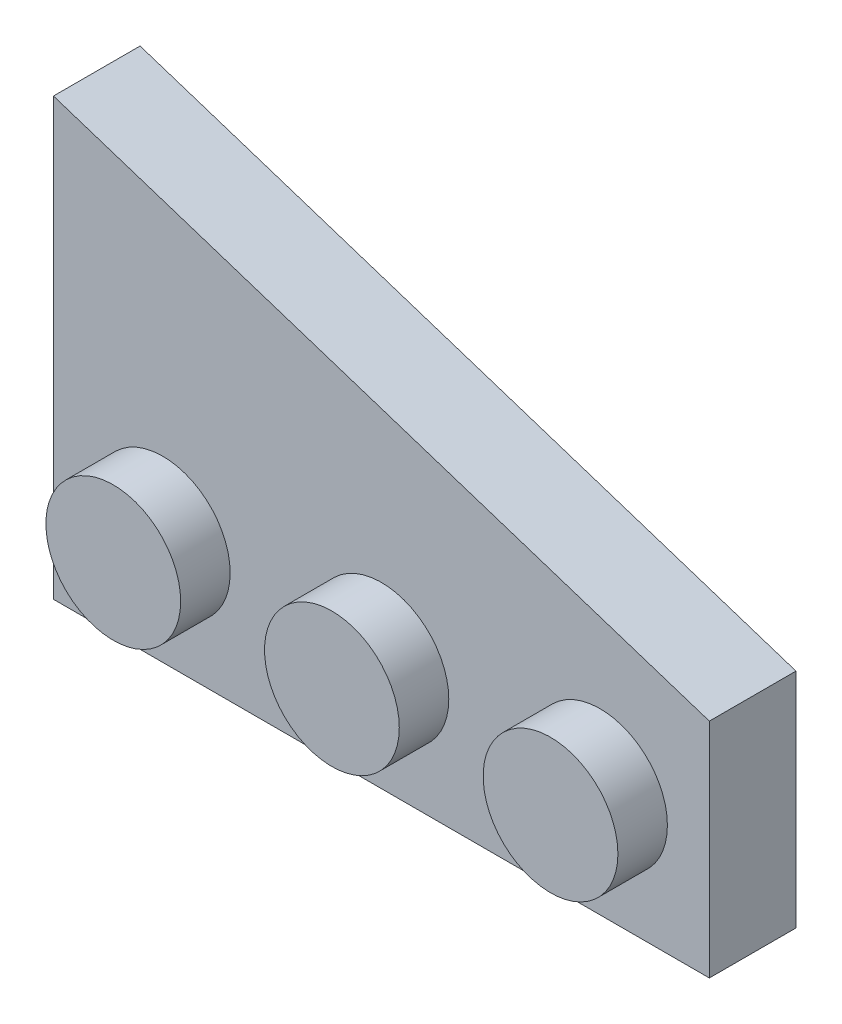
ISO-10303-21;
HEADER;
FILE_DESCRIPTION(('STEP AP214'),'2;1');
FILE_NAME('part.step','',(''),(''),'','','');
FILE_SCHEMA(('AUTOMOTIVE_DESIGN { 1 0 10303 214 1 1 1 1 }'));
ENDSEC;
DATA;
#1=APPLICATION_CONTEXT('core data for automotive mechanical design processes');
#2=APPLICATION_PROTOCOL_DEFINITION('international standard','automotive_design',2000,#1);
#3=PRODUCT_CONTEXT('',#1,'mechanical');
#4=PRODUCT('Part','Part','',(#3));
#5=PRODUCT_RELATED_PRODUCT_CATEGORY('part','',(#4));
#6=PRODUCT_DEFINITION_FORMATION('','',#4);
#7=PRODUCT_DEFINITION_CONTEXT('part definition',#1,'design');
#8=PRODUCT_DEFINITION('design','',#6,#7);
#9=PRODUCT_DEFINITION_SHAPE('','',#8);
#10=(LENGTH_UNIT() NAMED_UNIT(*) SI_UNIT(.MILLI.,.METRE.));
#11=(NAMED_UNIT(*) PLANE_ANGLE_UNIT() SI_UNIT($,.RADIAN.));
#12=(NAMED_UNIT(*) SI_UNIT($,.STERADIAN.) SOLID_ANGLE_UNIT());
#13=UNCERTAINTY_MEASURE_WITH_UNIT(LENGTH_MEASURE(1.E-05),#10,'distance_accuracy_value','');
#14=(GEOMETRIC_REPRESENTATION_CONTEXT(3) GLOBAL_UNCERTAINTY_ASSIGNED_CONTEXT((#13)) GLOBAL_UNIT_ASSIGNED_CONTEXT((#10,
#11,#12)) REPRESENTATION_CONTEXT('',''));
#15=CARTESIAN_POINT('',(0.,0.,0.));
#16=DIRECTION('',(0.,0.,1.));
#17=DIRECTION('',(1.,0.,0.));
#18=AXIS2_PLACEMENT_3D('',#15,#16,#17);
#19=CARTESIAN_POINT('',(0.,15.85,-3.15));
#20=DIRECTION('',(-1.,0.,0.));
#21=DIRECTION('',(0.,-1.,0.));
#22=AXIS2_PLACEMENT_3D('',#19,#20,#21);
#23=PLANE('',#22);
#24=DIRECTION('',(0.,-1.,0.));
#25=VECTOR('',#24,1.);
#26=CARTESIAN_POINT('',(0.,15.85,0.));
#27=LINE('',#26,#25);
#28=CARTESIAN_POINT('',(0.,15.85,0.));
#29=VERTEX_POINT('',#28);
#30=CARTESIAN_POINT('',(0.,0.,0.));
#31=VERTEX_POINT('',#30);
#32=EDGE_CURVE('E178',#29,#31,#27,.T.);
#33=ORIENTED_EDGE('',*,*,#32,.F.);
#34=DIRECTION('',(0.,0.,1.));
#35=VECTOR('',#34,1.);
#36=CARTESIAN_POINT('',(0.,15.85,-3.15));
#37=LINE('',#36,#35);
#38=CARTESIAN_POINT('',(0.,15.85,-3.15));
#39=VERTEX_POINT('',#38);
#40=EDGE_CURVE('E11',#39,#29,#37,.T.);
#41=ORIENTED_EDGE('',*,*,#40,.F.);
#42=DIRECTION('',(0.,-1.,0.));
#43=VECTOR('',#42,1.);
#44=CARTESIAN_POINT('',(0.,15.85,-3.15));
#45=LINE('',#44,#43);
#46=CARTESIAN_POINT('',(0.,0.,-3.15));
#47=VERTEX_POINT('',#46);
#48=EDGE_CURVE('E181',#39,#47,#45,.T.);
#49=ORIENTED_EDGE('',*,*,#48,.T.);
#50=DIRECTION('',(0.,0.,1.));
#51=VECTOR('',#50,1.);
#52=CARTESIAN_POINT('',(0.,0.,-3.15));
#53=LINE('',#52,#51);
#54=EDGE_CURVE('E35',#47,#31,#53,.T.);
#55=ORIENTED_EDGE('',*,*,#54,.T.);
#56=EDGE_LOOP('',(#33,#41,#49,#55));
#57=FACE_BOUND('',#56,.T.);
#58=ADVANCED_FACE('F32',(#57),#23,.T.);
#59=CARTESIAN_POINT('',(23.85,8.09,-3.15));
#60=DIRECTION('',(0.309401600131358,0.950931464321249,0.));
#61=DIRECTION('',(-0.950931464321249,0.309401600131358,0.));
#62=AXIS2_PLACEMENT_3D('',#59,#60,#61);
#63=PLANE('',#62);
#64=DIRECTION('',(-0.950931464321249,0.309401600131358,0.));
#65=VECTOR('',#64,1.);
#66=CARTESIAN_POINT('',(23.85,8.09,0.));
#67=LINE('',#66,#65);
#68=CARTESIAN_POINT('',(23.85,8.09,0.));
#69=VERTEX_POINT('',#68);
#70=EDGE_CURVE('E184',#69,#29,#67,.T.);
#71=ORIENTED_EDGE('',*,*,#70,.F.);
#72=DIRECTION('',(0.,0.,1.));
#73=VECTOR('',#72,1.);
#74=CARTESIAN_POINT('',(23.85,8.09,-3.15));
#75=LINE('',#74,#73);
#76=CARTESIAN_POINT('',(23.85,8.09,-3.15));
#77=VERTEX_POINT('',#76);
#78=EDGE_CURVE('E40',#77,#69,#75,.T.);
#79=ORIENTED_EDGE('',*,*,#78,.F.);
#80=DIRECTION('',(-0.950931464321249,0.309401600131358,0.));
#81=VECTOR('',#80,1.);
#82=CARTESIAN_POINT('',(23.85,8.09,-3.15));
#83=LINE('',#82,#81);
#84=EDGE_CURVE('E189',#77,#39,#83,.T.);
#85=ORIENTED_EDGE('',*,*,#84,.T.);
#86=ORIENTED_EDGE('',*,*,#40,.T.);
#87=EDGE_LOOP('',(#71,#79,#85,#86));
#88=FACE_BOUND('',#87,.T.);
#89=ADVANCED_FACE('F206',(#88),#63,.T.);
#90=CARTESIAN_POINT('',(23.85,0.,-3.15));
#91=DIRECTION('',(1.,0.,0.));
#92=DIRECTION('',(0.,1.,0.));
#93=AXIS2_PLACEMENT_3D('',#90,#91,#92);
#94=PLANE('',#93);
#95=DIRECTION('',(0.,1.,0.));
#96=VECTOR('',#95,1.);
#97=CARTESIAN_POINT('',(23.85,0.,0.));
#98=LINE('',#97,#96);
#99=CARTESIAN_POINT('',(23.85,0.,0.));
#100=VERTEX_POINT('',#99);
#101=EDGE_CURVE('E196',#100,#69,#98,.T.);
#102=ORIENTED_EDGE('',*,*,#101,.F.);
#103=DIRECTION('',(0.,0.,1.));
#104=VECTOR('',#103,1.);
#105=CARTESIAN_POINT('',(23.85,0.,-3.15));
#106=LINE('',#105,#104);
#107=CARTESIAN_POINT('',(23.85,0.,-3.15));
#108=VERTEX_POINT('',#107);
#109=EDGE_CURVE('E201',#108,#100,#106,.T.);
#110=ORIENTED_EDGE('',*,*,#109,.F.);
#111=DIRECTION('',(0.,1.,0.));
#112=VECTOR('',#111,1.);
#113=CARTESIAN_POINT('',(23.85,0.,-3.15));
#114=LINE('',#113,#112);
#115=EDGE_CURVE('E186',#108,#77,#114,.T.);
#116=ORIENTED_EDGE('',*,*,#115,.T.);
#117=ORIENTED_EDGE('',*,*,#78,.T.);
#118=EDGE_LOOP('',(#102,#110,#116,#117));
#119=FACE_BOUND('',#118,.T.);
#120=ADVANCED_FACE('F210',(#119),#94,.T.);
#121=CARTESIAN_POINT('',(0.,0.,-3.15));
#122=DIRECTION('',(0.,-1.,0.));
#123=DIRECTION('',(0.,0.,-1.));
#124=AXIS2_PLACEMENT_3D('',#121,#122,#123);
#125=PLANE('',#124);
#126=DIRECTION('',(1.,0.,0.));
#127=VECTOR('',#126,1.);
#128=CARTESIAN_POINT('',(0.,0.,0.));
#129=LINE('',#128,#127);
#130=EDGE_CURVE('E193',#31,#100,#129,.T.);
#131=ORIENTED_EDGE('',*,*,#130,.F.);
#132=ORIENTED_EDGE('',*,*,#54,.F.);
#133=DIRECTION('',(1.,0.,0.));
#134=VECTOR('',#133,1.);
#135=CARTESIAN_POINT('',(0.,0.,-3.15));
#136=LINE('',#135,#134);
#137=EDGE_CURVE('E183',#47,#108,#136,.T.);
#138=ORIENTED_EDGE('',*,*,#137,.T.);
#139=ORIENTED_EDGE('',*,*,#109,.T.);
#140=EDGE_LOOP('',(#131,#132,#138,#139));
#141=FACE_BOUND('',#140,.T.);
#142=ADVANCED_FACE('F203',(#141),#125,.T.);
#143=CARTESIAN_POINT('',(0.,0.,-3.15));
#144=DIRECTION('',(0.,0.,1.));
#145=DIRECTION('',(1.,0.,0.));
#146=AXIS2_PLACEMENT_3D('',#143,#144,#145);
#147=PLANE('',#146);
#148=DIRECTION('',(-0.950931464321249,0.309401600131358,0.));
#149=VECTOR('',#148,1.);
#150=CARTESIAN_POINT('',(4.19928010912153,12.9062926034212,-3.15));
#151=LINE('',#150,#149);
#152=CARTESIAN_POINT('',(22.35,7.00064956974333,-3.15));
#153=VERTEX_POINT('',#152);
#154=CARTESIAN_POINT('',(1.5,13.7845489408125,-3.15));
#155=VERTEX_POINT('',#154);
#156=EDGE_CURVE('E158',#153,#155,#151,.T.);
#157=ORIENTED_EDGE('',*,*,#156,.T.);
#158=DIRECTION('',(0.,-1.,0.));
#159=VECTOR('',#158,1.);
#160=CARTESIAN_POINT('',(1.5,0.,-3.15));
#161=LINE('',#160,#159);
#162=CARTESIAN_POINT('',(1.5,1.5,-3.15));
#163=VERTEX_POINT('',#162);
#164=EDGE_CURVE('E109',#155,#163,#161,.T.);
#165=ORIENTED_EDGE('',*,*,#164,.T.);
#166=DIRECTION('',(1.,0.,0.));
#167=VECTOR('',#166,1.);
#168=CARTESIAN_POINT('',(0.,1.5,-3.15));
#169=LINE('',#168,#167);
#170=CARTESIAN_POINT('',(22.35,1.5,-3.15));
#171=VERTEX_POINT('',#170);
#172=EDGE_CURVE('E131',#163,#171,#169,.T.);
#173=ORIENTED_EDGE('',*,*,#172,.T.);
#174=DIRECTION('',(0.,1.,0.));
#175=VECTOR('',#174,1.);
#176=CARTESIAN_POINT('',(22.35,0.,-3.15));
#177=LINE('',#176,#175);
#178=EDGE_CURVE('E48',#171,#153,#177,.T.);
#179=ORIENTED_EDGE('',*,*,#178,.T.);
#180=EDGE_LOOP('',(#157,#165,#173,#179));
#181=FACE_BOUND('',#180,.T.);
#182=ORIENTED_EDGE('',*,*,#48,.F.);
#183=ORIENTED_EDGE('',*,*,#84,.F.);
#184=ORIENTED_EDGE('',*,*,#115,.F.);
#185=ORIENTED_EDGE('',*,*,#137,.F.);
#186=EDGE_LOOP('',(#182,#183,#184,#185));
#187=FACE_BOUND('',#186,.T.);
#188=ADVANCED_FACE('F212',(#181,#187),#147,.F.);
#189=CARTESIAN_POINT('',(0.,0.,0.));
#190=DIRECTION('',(0.,0.,1.));
#191=DIRECTION('',(1.,0.,0.));
#192=AXIS2_PLACEMENT_3D('',#189,#190,#191);
#193=PLANE('',#192);
#194=CARTESIAN_POINT('',(19.875,4.045,0.));
#195=DIRECTION('',(0.,0.,1.));
#196=DIRECTION('',(1.,0.,0.));
#197=AXIS2_PLACEMENT_3D('',#194,#195,#196);
#198=CIRCLE('',#197,2.45);
#199=CARTESIAN_POINT('',(22.325,4.045,0.));
#200=VERTEX_POINT('',#199);
#201=EDGE_CURVE('E114',#200,#200,#198,.T.);
#202=ORIENTED_EDGE('',*,*,#201,.F.);
#203=EDGE_LOOP('',(#202));
#204=FACE_BOUND('',#203,.T.);
#205=CARTESIAN_POINT('',(11.925,4.045,0.));
#206=DIRECTION('',(0.,0.,1.));
#207=DIRECTION('',(1.,0.,0.));
#208=AXIS2_PLACEMENT_3D('',#205,#206,#207);
#209=CIRCLE('',#208,2.45);
#210=CARTESIAN_POINT('',(14.375,4.045,0.));
#211=VERTEX_POINT('',#210);
#212=EDGE_CURVE('E166',#211,#211,#209,.T.);
#213=ORIENTED_EDGE('',*,*,#212,.F.);
#214=EDGE_LOOP('',(#213));
#215=FACE_BOUND('',#214,.T.);
#216=CARTESIAN_POINT('',(3.975,4.045,0.));
#217=DIRECTION('',(0.,0.,1.));
#218=DIRECTION('',(1.,0.,0.));
#219=AXIS2_PLACEMENT_3D('',#216,#217,#218);
#220=CIRCLE('',#219,2.45);
#221=CARTESIAN_POINT('',(6.425,4.045,0.));
#222=VERTEX_POINT('',#221);
#223=EDGE_CURVE('E172',#222,#222,#220,.T.);
#224=ORIENTED_EDGE('',*,*,#223,.F.);
#225=EDGE_LOOP('',(#224));
#226=FACE_BOUND('',#225,.T.);
#227=ORIENTED_EDGE('',*,*,#32,.T.);
#228=ORIENTED_EDGE('',*,*,#130,.T.);
#229=ORIENTED_EDGE('',*,*,#101,.T.);
#230=ORIENTED_EDGE('',*,*,#70,.T.);
#231=EDGE_LOOP('',(#227,#228,#229,#230));
#232=FACE_BOUND('',#231,.T.);
#233=ADVANCED_FACE('F205',(#204,#215,#226,#232),#193,.T.);
#234=CARTESIAN_POINT('',(3.975,4.045,1.8));
#235=DIRECTION('',(0.,0.,-1.));
#236=DIRECTION('',(-1.,0.,0.));
#237=AXIS2_PLACEMENT_3D('',#234,#235,#236);
#238=CYLINDRICAL_SURFACE('',#237,2.45);
#239=CARTESIAN_POINT('',(3.975,4.045,1.8));
#240=DIRECTION('',(0.,0.,1.));
#241=DIRECTION('',(1.,0.,0.));
#242=AXIS2_PLACEMENT_3D('',#239,#240,#241);
#243=CIRCLE('',#242,2.45);
#244=CARTESIAN_POINT('',(6.425,4.045,1.8));
#245=VERTEX_POINT('',#244);
#246=EDGE_CURVE('E175',#245,#245,#243,.T.);
#247=ORIENTED_EDGE('',*,*,#246,.F.);
#248=EDGE_LOOP('',(#247));
#249=FACE_BOUND('',#248,.T.);
#250=ORIENTED_EDGE('',*,*,#223,.T.);
#251=EDGE_LOOP('',(#250));
#252=FACE_BOUND('',#251,.T.);
#253=ADVANCED_FACE('F220',(#249,#252),#238,.T.);
#254=CARTESIAN_POINT('',(3.975,4.045,1.8));
#255=DIRECTION('',(0.,0.,1.));
#256=DIRECTION('',(1.,0.,0.));
#257=AXIS2_PLACEMENT_3D('',#254,#255,#256);
#258=PLANE('',#257);
#259=ORIENTED_EDGE('',*,*,#246,.T.);
#260=EDGE_LOOP('',(#259));
#261=FACE_BOUND('',#260,.T.);
#262=ADVANCED_FACE('F255',(#261),#258,.T.);
#263=CARTESIAN_POINT('',(11.925,4.045,1.8));
#264=DIRECTION('',(0.,0.,-1.));
#265=DIRECTION('',(-1.,0.,0.));
#266=AXIS2_PLACEMENT_3D('',#263,#264,#265);
#267=CYLINDRICAL_SURFACE('',#266,2.45);
#268=CARTESIAN_POINT('',(11.925,4.045,1.8));
#269=DIRECTION('',(0.,0.,1.));
#270=DIRECTION('',(1.,0.,0.));
#271=AXIS2_PLACEMENT_3D('',#268,#269,#270);
#272=CIRCLE('',#271,2.45);
#273=CARTESIAN_POINT('',(14.375,4.045,1.8));
#274=VERTEX_POINT('',#273);
#275=EDGE_CURVE('E169',#274,#274,#272,.T.);
#276=ORIENTED_EDGE('',*,*,#275,.F.);
#277=EDGE_LOOP('',(#276));
#278=FACE_BOUND('',#277,.T.);
#279=ORIENTED_EDGE('',*,*,#212,.T.);
#280=EDGE_LOOP('',(#279));
#281=FACE_BOUND('',#280,.T.);
#282=ADVANCED_FACE('F264',(#278,#281),#267,.T.);
#283=CARTESIAN_POINT('',(11.925,4.045,1.8));
#284=DIRECTION('',(0.,0.,1.));
#285=DIRECTION('',(1.,0.,0.));
#286=AXIS2_PLACEMENT_3D('',#283,#284,#285);
#287=PLANE('',#286);
#288=ORIENTED_EDGE('',*,*,#275,.T.);
#289=EDGE_LOOP('',(#288));
#290=FACE_BOUND('',#289,.T.);
#291=ADVANCED_FACE('F274',(#290),#287,.T.);
#292=CARTESIAN_POINT('',(19.875,4.045,1.8));
#293=DIRECTION('',(0.,0.,-1.));
#294=DIRECTION('',(-1.,0.,0.));
#295=AXIS2_PLACEMENT_3D('',#292,#293,#294);
#296=CYLINDRICAL_SURFACE('',#295,2.45);
#297=CARTESIAN_POINT('',(19.875,4.045,1.8));
#298=DIRECTION('',(0.,0.,1.));
#299=DIRECTION('',(1.,0.,0.));
#300=AXIS2_PLACEMENT_3D('',#297,#298,#299);
#301=CIRCLE('',#300,2.45);
#302=CARTESIAN_POINT('',(22.325,4.045,1.8));
#303=VERTEX_POINT('',#302);
#304=EDGE_CURVE('E163',#303,#303,#301,.T.);
#305=ORIENTED_EDGE('',*,*,#304,.F.);
#306=EDGE_LOOP('',(#305));
#307=FACE_BOUND('',#306,.T.);
#308=ORIENTED_EDGE('',*,*,#201,.T.);
#309=EDGE_LOOP('',(#308));
#310=FACE_BOUND('',#309,.T.);
#311=ADVANCED_FACE('F284',(#307,#310),#296,.T.);
#312=CARTESIAN_POINT('',(19.875,4.045,1.8));
#313=DIRECTION('',(0.,0.,1.));
#314=DIRECTION('',(1.,0.,0.));
#315=AXIS2_PLACEMENT_3D('',#312,#313,#314);
#316=PLANE('',#315);
#317=ORIENTED_EDGE('',*,*,#304,.T.);
#318=EDGE_LOOP('',(#317));
#319=FACE_BOUND('',#318,.T.);
#320=ADVANCED_FACE('F294',(#319),#316,.T.);
#321=CARTESIAN_POINT('',(1.5,15.85,-3.15));
#322=DIRECTION('',(-1.,0.,0.));
#323=DIRECTION('',(0.,-1.,0.));
#324=AXIS2_PLACEMENT_3D('',#321,#322,#323);
#325=PLANE('',#324);
#326=DIRECTION('',(0.,-1.,0.));
#327=VECTOR('',#326,1.);
#328=CARTESIAN_POINT('',(1.5,0.,-1.5));
#329=LINE('',#328,#327);
#330=CARTESIAN_POINT('',(1.5,13.7845489408125,-1.5));
#331=VERTEX_POINT('',#330);
#332=CARTESIAN_POINT('',(1.5,1.5,-1.5));
#333=VERTEX_POINT('',#332);
#334=EDGE_CURVE('E107',#331,#333,#329,.T.);
#335=ORIENTED_EDGE('',*,*,#334,.T.);
#336=DIRECTION('',(0.,0.,1.));
#337=VECTOR('',#336,1.);
#338=CARTESIAN_POINT('',(1.5,1.5,-3.15));
#339=LINE('',#338,#337);
#340=EDGE_CURVE('E136',#163,#333,#339,.T.);
#341=ORIENTED_EDGE('',*,*,#340,.F.);
#342=ORIENTED_EDGE('',*,*,#164,.F.);
#343=DIRECTION('',(0.,0.,1.));
#344=VECTOR('',#343,1.);
#345=CARTESIAN_POINT('',(1.5,13.7845489408125,-3.15));
#346=LINE('',#345,#344);
#347=EDGE_CURVE('E104',#155,#331,#346,.T.);
#348=ORIENTED_EDGE('',*,*,#347,.T.);
#349=EDGE_LOOP('',(#335,#341,#342,#348));
#350=FACE_BOUND('',#349,.T.);
#351=ADVANCED_FACE('F106',(#350),#325,.F.);
#352=CARTESIAN_POINT('',(23.385897599803,6.66360280351813,-3.15));
#353=DIRECTION('',(0.309401600131358,0.950931464321249,0.));
#354=DIRECTION('',(-0.950931464321249,0.309401600131358,0.));
#355=AXIS2_PLACEMENT_3D('',#352,#353,#354);
#356=PLANE('',#355);
#357=DIRECTION('',(-0.950931464321249,0.309401600131358,0.));
#358=VECTOR('',#357,1.);
#359=CARTESIAN_POINT('',(4.19928010912153,12.9062926034212,-1.5));
#360=LINE('',#359,#358);
#361=CARTESIAN_POINT('',(22.35,7.00064956974333,-1.5));
#362=VERTEX_POINT('',#361);
#363=EDGE_CURVE('E122',#362,#331,#360,.T.);
#364=ORIENTED_EDGE('',*,*,#363,.T.);
#365=ORIENTED_EDGE('',*,*,#347,.F.);
#366=ORIENTED_EDGE('',*,*,#156,.F.);
#367=DIRECTION('',(0.,0.,1.));
#368=VECTOR('',#367,1.);
#369=CARTESIAN_POINT('',(22.35,7.00064956974333,-3.15));
#370=LINE('',#369,#368);
#371=EDGE_CURVE('E115',#153,#362,#370,.T.);
#372=ORIENTED_EDGE('',*,*,#371,.T.);
#373=EDGE_LOOP('',(#364,#365,#366,#372));
#374=FACE_BOUND('',#373,.T.);
#375=ADVANCED_FACE('F127',(#374),#356,.F.);
#376=CARTESIAN_POINT('',(22.35,0.,-3.15));
#377=DIRECTION('',(1.,0.,0.));
#378=DIRECTION('',(0.,1.,0.));
#379=AXIS2_PLACEMENT_3D('',#376,#377,#378);
#380=PLANE('',#379);
#381=DIRECTION('',(0.,1.,0.));
#382=VECTOR('',#381,1.);
#383=CARTESIAN_POINT('',(22.35,0.,-1.5));
#384=LINE('',#383,#382);
#385=CARTESIAN_POINT('',(22.35,1.5,-1.5));
#386=VERTEX_POINT('',#385);
#387=EDGE_CURVE('E129',#386,#362,#384,.T.);
#388=ORIENTED_EDGE('',*,*,#387,.T.);
#389=ORIENTED_EDGE('',*,*,#371,.F.);
#390=ORIENTED_EDGE('',*,*,#178,.F.);
#391=DIRECTION('',(0.,0.,1.));
#392=VECTOR('',#391,1.);
#393=CARTESIAN_POINT('',(22.35,1.5,-3.15));
#394=LINE('',#393,#392);
#395=EDGE_CURVE('E137',#171,#386,#394,.T.);
#396=ORIENTED_EDGE('',*,*,#395,.T.);
#397=EDGE_LOOP('',(#388,#389,#390,#396));
#398=FACE_BOUND('',#397,.T.);
#399=ADVANCED_FACE('F324',(#398),#380,.F.);
#400=CARTESIAN_POINT('',(0.,1.5,-3.15));
#401=DIRECTION('',(0.,-1.,0.));
#402=DIRECTION('',(0.,0.,-1.));
#403=AXIS2_PLACEMENT_3D('',#400,#401,#402);
#404=PLANE('',#403);
#405=DIRECTION('',(1.,0.,0.));
#406=VECTOR('',#405,1.);
#407=CARTESIAN_POINT('',(0.,1.5,-1.5));
#408=LINE('',#407,#406);
#409=EDGE_CURVE('E124',#333,#386,#408,.T.);
#410=ORIENTED_EDGE('',*,*,#409,.T.);
#411=ORIENTED_EDGE('',*,*,#395,.F.);
#412=ORIENTED_EDGE('',*,*,#172,.F.);
#413=ORIENTED_EDGE('',*,*,#340,.T.);
#414=EDGE_LOOP('',(#410,#411,#412,#413));
#415=FACE_BOUND('',#414,.T.);
#416=ADVANCED_FACE('F333',(#415),#404,.F.);
#417=CARTESIAN_POINT('',(0.,0.,-1.5));
#418=DIRECTION('',(0.,0.,1.));
#419=DIRECTION('',(1.,0.,0.));
#420=AXIS2_PLACEMENT_3D('',#417,#418,#419);
#421=PLANE('',#420);
#422=CARTESIAN_POINT('',(19.875,4.045,-1.5));
#423=DIRECTION('',(0.,0.,1.));
#424=DIRECTION('',(1.,0.,0.));
#425=AXIS2_PLACEMENT_3D('',#422,#423,#424);
#426=CIRCLE('',#425,0.950000000000002);
#427=CARTESIAN_POINT('',(20.825,4.045,-1.5));
#428=VERTEX_POINT('',#427);
#429=EDGE_CURVE('E141',#428,#428,#426,.T.);
#430=ORIENTED_EDGE('',*,*,#429,.T.);
#431=EDGE_LOOP('',(#430));
#432=FACE_BOUND('',#431,.T.);
#433=CARTESIAN_POINT('',(11.925,4.045,-1.5));
#434=DIRECTION('',(0.,0.,1.));
#435=DIRECTION('',(1.,0.,0.));
#436=AXIS2_PLACEMENT_3D('',#433,#434,#435);
#437=CIRCLE('',#436,0.950000000000002);
#438=CARTESIAN_POINT('',(12.875,4.045,-1.5));
#439=VERTEX_POINT('',#438);
#440=EDGE_CURVE('E145',#439,#439,#437,.T.);
#441=ORIENTED_EDGE('',*,*,#440,.T.);
#442=EDGE_LOOP('',(#441));
#443=FACE_BOUND('',#442,.T.);
#444=CARTESIAN_POINT('',(3.975,4.045,-1.5));
#445=DIRECTION('',(0.,0.,1.));
#446=DIRECTION('',(1.,0.,0.));
#447=AXIS2_PLACEMENT_3D('',#444,#445,#446);
#448=CIRCLE('',#447,0.950000000000003);
#449=CARTESIAN_POINT('',(4.925,4.045,-1.5));
#450=VERTEX_POINT('',#449);
#451=EDGE_CURVE('E149',#450,#450,#448,.T.);
#452=ORIENTED_EDGE('',*,*,#451,.T.);
#453=EDGE_LOOP('',(#452));
#454=FACE_BOUND('',#453,.T.);
#455=ORIENTED_EDGE('',*,*,#334,.F.);
#456=ORIENTED_EDGE('',*,*,#363,.F.);
#457=ORIENTED_EDGE('',*,*,#387,.F.);
#458=ORIENTED_EDGE('',*,*,#409,.F.);
#459=EDGE_LOOP('',(#455,#456,#457,#458));
#460=FACE_BOUND('',#459,.T.);
#461=ADVANCED_FACE('F120',(#432,#443,#454,#460),#421,.F.);
#462=CARTESIAN_POINT('',(3.975,4.045,1.8));
#463=DIRECTION('',(0.,0.,-1.));
#464=DIRECTION('',(-1.,0.,0.));
#465=AXIS2_PLACEMENT_3D('',#462,#463,#464);
#466=CYLINDRICAL_SURFACE('',#465,0.950000000000003);
#467=CARTESIAN_POINT('',(3.975,4.045,0.3));
#468=DIRECTION('',(0.,0.,1.));
#469=DIRECTION('',(1.,0.,0.));
#470=AXIS2_PLACEMENT_3D('',#467,#468,#469);
#471=CIRCLE('',#470,0.950000000000003);
#472=CARTESIAN_POINT('',(4.925,4.045,0.3));
#473=VERTEX_POINT('',#472);
#474=EDGE_CURVE('E125',#473,#473,#471,.T.);
#475=ORIENTED_EDGE('',*,*,#474,.T.);
#476=EDGE_LOOP('',(#475));
#477=FACE_BOUND('',#476,.T.);
#478=ORIENTED_EDGE('',*,*,#451,.F.);
#479=EDGE_LOOP('',(#478));
#480=FACE_BOUND('',#479,.T.);
#481=ADVANCED_FACE('F351',(#477,#480),#466,.F.);
#482=CARTESIAN_POINT('',(3.975,4.045,0.3));
#483=DIRECTION('',(0.,0.,1.));
#484=DIRECTION('',(1.,0.,0.));
#485=AXIS2_PLACEMENT_3D('',#482,#483,#484);
#486=PLANE('',#485);
#487=ORIENTED_EDGE('',*,*,#474,.F.);
#488=EDGE_LOOP('',(#487));
#489=FACE_BOUND('',#488,.T.);
#490=ADVANCED_FACE('F361',(#489),#486,.F.);
#491=CARTESIAN_POINT('',(11.925,4.045,1.8));
#492=DIRECTION('',(0.,0.,-1.));
#493=DIRECTION('',(-1.,0.,0.));
#494=AXIS2_PLACEMENT_3D('',#491,#492,#493);
#495=CYLINDRICAL_SURFACE('',#494,0.950000000000002);
#496=CARTESIAN_POINT('',(11.925,4.045,0.3));
#497=DIRECTION('',(0.,0.,1.));
#498=DIRECTION('',(1.,0.,0.));
#499=AXIS2_PLACEMENT_3D('',#496,#497,#498);
#500=CIRCLE('',#499,0.950000000000002);
#501=CARTESIAN_POINT('',(12.875,4.045,0.3));
#502=VERTEX_POINT('',#501);
#503=EDGE_CURVE('E148',#502,#502,#500,.T.);
#504=ORIENTED_EDGE('',*,*,#503,.T.);
#505=EDGE_LOOP('',(#504));
#506=FACE_BOUND('',#505,.T.);
#507=ORIENTED_EDGE('',*,*,#440,.F.);
#508=EDGE_LOOP('',(#507));
#509=FACE_BOUND('',#508,.T.);
#510=ADVANCED_FACE('F371',(#506,#509),#495,.F.);
#511=CARTESIAN_POINT('',(11.925,4.045,0.3));
#512=DIRECTION('',(0.,0.,1.));
#513=DIRECTION('',(1.,0.,0.));
#514=AXIS2_PLACEMENT_3D('',#511,#512,#513);
#515=PLANE('',#514);
#516=ORIENTED_EDGE('',*,*,#503,.F.);
#517=EDGE_LOOP('',(#516));
#518=FACE_BOUND('',#517,.T.);
#519=ADVANCED_FACE('F381',(#518),#515,.F.);
#520=CARTESIAN_POINT('',(19.875,4.045,1.8));
#521=DIRECTION('',(0.,0.,-1.));
#522=DIRECTION('',(-1.,0.,0.));
#523=AXIS2_PLACEMENT_3D('',#520,#521,#522);
#524=CYLINDRICAL_SURFACE('',#523,0.950000000000002);
#525=CARTESIAN_POINT('',(19.875,4.045,0.3));
#526=DIRECTION('',(0.,0.,1.));
#527=DIRECTION('',(1.,0.,0.));
#528=AXIS2_PLACEMENT_3D('',#525,#526,#527);
#529=CIRCLE('',#528,0.950000000000002);
#530=CARTESIAN_POINT('',(20.825,4.045,0.3));
#531=VERTEX_POINT('',#530);
#532=EDGE_CURVE('E144',#531,#531,#529,.T.);
#533=ORIENTED_EDGE('',*,*,#532,.T.);
#534=EDGE_LOOP('',(#533));
#535=FACE_BOUND('',#534,.T.);
#536=ORIENTED_EDGE('',*,*,#429,.F.);
#537=EDGE_LOOP('',(#536));
#538=FACE_BOUND('',#537,.T.);
#539=ADVANCED_FACE('F391',(#535,#538),#524,.F.);
#540=CARTESIAN_POINT('',(19.875,4.045,0.3));
#541=DIRECTION('',(0.,0.,1.));
#542=DIRECTION('',(1.,0.,0.));
#543=AXIS2_PLACEMENT_3D('',#540,#541,#542);
#544=PLANE('',#543);
#545=ORIENTED_EDGE('',*,*,#532,.F.);
#546=EDGE_LOOP('',(#545));
#547=FACE_BOUND('',#546,.T.);
#548=ADVANCED_FACE('F401',(#547),#544,.F.);
#549=CLOSED_SHELL('',(#58,#89,#120,#142,#188,#233,#253,#262,#282,#291,#311,#320,#351,#375,#399,
#416,#461,#481,#490,#510,#519,#539,#548));
#550=MANIFOLD_SOLID_BREP('B2',#549);
#551=ADVANCED_BREP_SHAPE_REPRESENTATION('',(#18,#550),#14);
#552=SHAPE_DEFINITION_REPRESENTATION(#9,#551);
ENDSEC;
END-ISO-10303-21;
